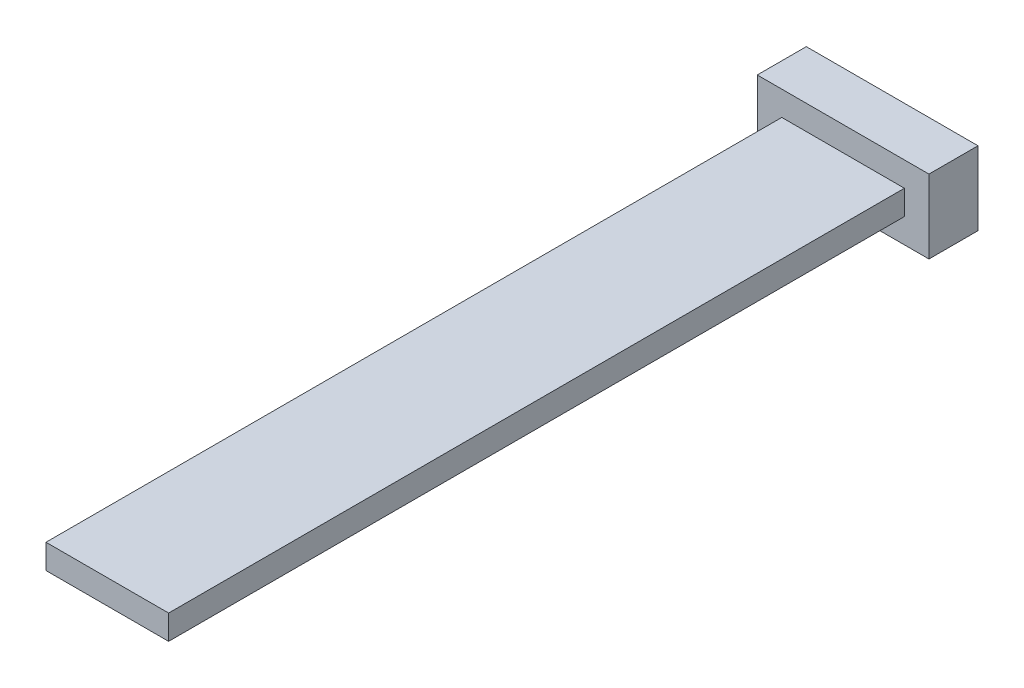
ISO-10303-21;
HEADER;
FILE_DESCRIPTION(('STEP AP214'),'2;1');
FILE_NAME('part.step','',(''),(''),'','','');
FILE_SCHEMA(('AUTOMOTIVE_DESIGN { 1 0 10303 214 1 1 1 1 }'));
ENDSEC;
DATA;
#1=APPLICATION_CONTEXT('core data for automotive mechanical design processes');
#2=APPLICATION_PROTOCOL_DEFINITION('international standard','automotive_design',2000,#1);
#3=PRODUCT_CONTEXT('',#1,'mechanical');
#4=PRODUCT('Part','Part','',(#3));
#5=PRODUCT_RELATED_PRODUCT_CATEGORY('part','',(#4));
#6=PRODUCT_DEFINITION_FORMATION('','',#4);
#7=PRODUCT_DEFINITION_CONTEXT('part definition',#1,'design');
#8=PRODUCT_DEFINITION('design','',#6,#7);
#9=PRODUCT_DEFINITION_SHAPE('','',#8);
#10=(LENGTH_UNIT() NAMED_UNIT(*) SI_UNIT(.MILLI.,.METRE.));
#11=(NAMED_UNIT(*) PLANE_ANGLE_UNIT() SI_UNIT($,.RADIAN.));
#12=(NAMED_UNIT(*) SI_UNIT($,.STERADIAN.) SOLID_ANGLE_UNIT());
#13=UNCERTAINTY_MEASURE_WITH_UNIT(LENGTH_MEASURE(1.E-05),#10,'distance_accuracy_value','');
#14=(GEOMETRIC_REPRESENTATION_CONTEXT(3) GLOBAL_UNCERTAINTY_ASSIGNED_CONTEXT((#13)) GLOBAL_UNIT_ASSIGNED_CONTEXT((#10,
#11,#12)) REPRESENTATION_CONTEXT('',''));
#15=CARTESIAN_POINT('',(0.,0.,0.));
#16=DIRECTION('',(0.,0.,1.));
#17=DIRECTION('',(1.,0.,0.));
#18=AXIS2_PLACEMENT_3D('',#15,#16,#17);
#19=CARTESIAN_POINT('',(0.,0.,300.));
#20=DIRECTION('',(1.,0.,0.));
#21=DIRECTION('',(0.,0.,-1.));
#22=AXIS2_PLACEMENT_3D('',#19,#20,#21);
#23=PLANE('',#22);
#24=DIRECTION('',(0.,-1.,0.));
#25=VECTOR('',#24,1.);
#26=CARTESIAN_POINT('',(0.,0.,0.));
#27=LINE('',#26,#25);
#28=CARTESIAN_POINT('',(0.,10.,0.));
#29=VERTEX_POINT('',#28);
#30=CARTESIAN_POINT('',(0.,0.,0.));
#31=VERTEX_POINT('',#30);
#32=EDGE_CURVE('E124',#29,#31,#27,.T.);
#33=ORIENTED_EDGE('',*,*,#32,.T.);
#34=DIRECTION('',(0.,0.,-1.));
#35=VECTOR('',#34,1.);
#36=CARTESIAN_POINT('',(0.,0.,300.));
#37=LINE('',#36,#35);
#38=CARTESIAN_POINT('',(0.,0.,300.));
#39=VERTEX_POINT('',#38);
#40=EDGE_CURVE('E11',#39,#31,#37,.T.);
#41=ORIENTED_EDGE('',*,*,#40,.F.);
#42=DIRECTION('',(0.,-1.,0.));
#43=VECTOR('',#42,1.);
#44=CARTESIAN_POINT('',(0.,0.,300.));
#45=LINE('',#44,#43);
#46=CARTESIAN_POINT('',(0.,10.,300.));
#47=VERTEX_POINT('',#46);
#48=EDGE_CURVE('E133',#47,#39,#45,.T.);
#49=ORIENTED_EDGE('',*,*,#48,.F.);
#50=DIRECTION('',(0.,0.,-1.));
#51=VECTOR('',#50,1.);
#52=CARTESIAN_POINT('',(0.,10.,300.));
#53=LINE('',#52,#51);
#54=EDGE_CURVE('E140',#47,#29,#53,.T.);
#55=ORIENTED_EDGE('',*,*,#54,.T.);
#56=EDGE_LOOP('',(#33,#41,#49,#55));
#57=FACE_BOUND('',#56,.T.);
#58=ADVANCED_FACE('F39',(#57),#23,.F.);
#59=CARTESIAN_POINT('',(0.,0.,300.));
#60=DIRECTION('',(0.,1.,0.));
#61=DIRECTION('',(0.,0.,1.));
#62=AXIS2_PLACEMENT_3D('',#59,#60,#61);
#63=PLANE('',#62);
#64=DIRECTION('',(1.,0.,0.));
#65=VECTOR('',#64,1.);
#66=CARTESIAN_POINT('',(0.,0.,0.));
#67=LINE('',#66,#65);
#68=CARTESIAN_POINT('',(50.,0.,0.));
#69=VERTEX_POINT('',#68);
#70=EDGE_CURVE('E127',#31,#69,#67,.T.);
#71=ORIENTED_EDGE('',*,*,#70,.T.);
#72=DIRECTION('',(0.,0.,-1.));
#73=VECTOR('',#72,1.);
#74=CARTESIAN_POINT('',(50.,0.,300.));
#75=LINE('',#74,#73);
#76=CARTESIAN_POINT('',(50.,0.,300.));
#77=VERTEX_POINT('',#76);
#78=EDGE_CURVE('E47',#77,#69,#75,.T.);
#79=ORIENTED_EDGE('',*,*,#78,.F.);
#80=DIRECTION('',(1.,0.,0.));
#81=VECTOR('',#80,1.);
#82=CARTESIAN_POINT('',(0.,0.,300.));
#83=LINE('',#82,#81);
#84=EDGE_CURVE('E135',#39,#77,#83,.T.);
#85=ORIENTED_EDGE('',*,*,#84,.F.);
#86=ORIENTED_EDGE('',*,*,#40,.T.);
#87=EDGE_LOOP('',(#71,#79,#85,#86));
#88=FACE_BOUND('',#87,.T.);
#89=ADVANCED_FACE('F160',(#88),#63,.F.);
#90=CARTESIAN_POINT('',(50.,0.,300.));
#91=DIRECTION('',(-1.,0.,0.));
#92=DIRECTION('',(0.,0.,1.));
#93=AXIS2_PLACEMENT_3D('',#90,#91,#92);
#94=PLANE('',#93);
#95=DIRECTION('',(0.,1.,0.));
#96=VECTOR('',#95,1.);
#97=CARTESIAN_POINT('',(50.,0.,0.));
#98=LINE('',#97,#96);
#99=CARTESIAN_POINT('',(50.,10.,0.));
#100=VERTEX_POINT('',#99);
#101=EDGE_CURVE('E144',#69,#100,#98,.T.);
#102=ORIENTED_EDGE('',*,*,#101,.T.);
#103=DIRECTION('',(0.,0.,-1.));
#104=VECTOR('',#103,1.);
#105=CARTESIAN_POINT('',(50.,10.,300.));
#106=LINE('',#105,#104);
#107=CARTESIAN_POINT('',(50.,10.,300.));
#108=VERTEX_POINT('',#107);
#109=EDGE_CURVE('E151',#108,#100,#106,.T.);
#110=ORIENTED_EDGE('',*,*,#109,.F.);
#111=DIRECTION('',(0.,1.,0.));
#112=VECTOR('',#111,1.);
#113=CARTESIAN_POINT('',(50.,0.,300.));
#114=LINE('',#113,#112);
#115=EDGE_CURVE('E138',#77,#108,#114,.T.);
#116=ORIENTED_EDGE('',*,*,#115,.F.);
#117=ORIENTED_EDGE('',*,*,#78,.T.);
#118=EDGE_LOOP('',(#102,#110,#116,#117));
#119=FACE_BOUND('',#118,.T.);
#120=ADVANCED_FACE('F157',(#119),#94,.F.);
#121=CARTESIAN_POINT('',(0.,10.,300.));
#122=DIRECTION('',(0.,-1.,0.));
#123=DIRECTION('',(0.,0.,-1.));
#124=AXIS2_PLACEMENT_3D('',#121,#122,#123);
#125=PLANE('',#124);
#126=DIRECTION('',(-1.,0.,0.));
#127=VECTOR('',#126,1.);
#128=CARTESIAN_POINT('',(0.,10.,0.));
#129=LINE('',#128,#127);
#130=EDGE_CURVE('E136',#100,#29,#129,.T.);
#131=ORIENTED_EDGE('',*,*,#130,.T.);
#132=ORIENTED_EDGE('',*,*,#54,.F.);
#133=DIRECTION('',(-1.,0.,0.));
#134=VECTOR('',#133,1.);
#135=CARTESIAN_POINT('',(0.,10.,300.));
#136=LINE('',#135,#134);
#137=EDGE_CURVE('E54',#108,#47,#136,.T.);
#138=ORIENTED_EDGE('',*,*,#137,.F.);
#139=ORIENTED_EDGE('',*,*,#109,.T.);
#140=EDGE_LOOP('',(#131,#132,#138,#139));
#141=FACE_BOUND('',#140,.T.);
#142=ADVANCED_FACE('F166',(#141),#125,.F.);
#143=CARTESIAN_POINT('',(0.,10.,300.));
#144=DIRECTION('',(0.,0.,-1.));
#145=DIRECTION('',(-1.,0.,0.));
#146=AXIS2_PLACEMENT_3D('',#143,#144,#145);
#147=PLANE('',#146);
#148=ORIENTED_EDGE('',*,*,#48,.T.);
#149=ORIENTED_EDGE('',*,*,#84,.T.);
#150=ORIENTED_EDGE('',*,*,#115,.T.);
#151=ORIENTED_EDGE('',*,*,#137,.T.);
#152=EDGE_LOOP('',(#148,#149,#150,#151));
#153=FACE_BOUND('',#152,.T.);
#154=ADVANCED_FACE('F169',(#153),#147,.F.);
#155=CARTESIAN_POINT('',(0.,0.,0.));
#156=DIRECTION('',(0.,0.,1.));
#157=DIRECTION('',(1.,0.,0.));
#158=AXIS2_PLACEMENT_3D('',#155,#156,#157);
#159=PLANE('',#158);
#160=DIRECTION('',(0.,1.,0.));
#161=VECTOR('',#160,1.);
#162=CARTESIAN_POINT('',(-10.,20.,0.));
#163=LINE('',#162,#161);
#164=CARTESIAN_POINT('',(-10.,-10.,0.));
#165=VERTEX_POINT('',#164);
#166=CARTESIAN_POINT('',(-10.,20.,0.));
#167=VERTEX_POINT('',#166);
#168=EDGE_CURVE('E123',#165,#167,#163,.T.);
#169=ORIENTED_EDGE('',*,*,#168,.F.);
#170=DIRECTION('',(-1.,0.,0.));
#171=VECTOR('',#170,1.);
#172=CARTESIAN_POINT('',(-10.,-10.,0.));
#173=LINE('',#172,#171);
#174=CARTESIAN_POINT('',(60.,-10.,0.));
#175=VERTEX_POINT('',#174);
#176=EDGE_CURVE('E119',#175,#165,#173,.T.);
#177=ORIENTED_EDGE('',*,*,#176,.F.);
#178=DIRECTION('',(0.,-1.,0.));
#179=VECTOR('',#178,1.);
#180=CARTESIAN_POINT('',(60.,20.,0.));
#181=LINE('',#180,#179);
#182=CARTESIAN_POINT('',(60.,20.,0.));
#183=VERTEX_POINT('',#182);
#184=EDGE_CURVE('E253',#183,#175,#181,.T.);
#185=ORIENTED_EDGE('',*,*,#184,.F.);
#186=DIRECTION('',(1.,0.,0.));
#187=VECTOR('',#186,1.);
#188=CARTESIAN_POINT('',(-10.,20.,0.));
#189=LINE('',#188,#187);
#190=EDGE_CURVE('E256',#167,#183,#189,.T.);
#191=ORIENTED_EDGE('',*,*,#190,.F.);
#192=EDGE_LOOP('',(#169,#177,#185,#191));
#193=FACE_BOUND('',#192,.T.);
#194=ORIENTED_EDGE('',*,*,#32,.F.);
#195=ORIENTED_EDGE('',*,*,#130,.F.);
#196=ORIENTED_EDGE('',*,*,#101,.F.);
#197=ORIENTED_EDGE('',*,*,#70,.F.);
#198=EDGE_LOOP('',(#194,#195,#196,#197));
#199=FACE_BOUND('',#198,.T.);
#200=ADVANCED_FACE('F164',(#193,#199),#159,.T.);
#201=CARTESIAN_POINT('',(-10.,20.,-20.));
#202=DIRECTION('',(1.,0.,0.));
#203=DIRECTION('',(0.,1.,0.));
#204=AXIS2_PLACEMENT_3D('',#201,#202,#203);
#205=PLANE('',#204);
#206=ORIENTED_EDGE('',*,*,#168,.T.);
#207=DIRECTION('',(0.,0.,1.));
#208=VECTOR('',#207,1.);
#209=CARTESIAN_POINT('',(-10.,20.,-20.));
#210=LINE('',#209,#208);
#211=CARTESIAN_POINT('',(-10.,20.,-20.));
#212=VERTEX_POINT('',#211);
#213=EDGE_CURVE('E103',#212,#167,#210,.T.);
#214=ORIENTED_EDGE('',*,*,#213,.F.);
#215=DIRECTION('',(0.,1.,0.));
#216=VECTOR('',#215,1.);
#217=CARTESIAN_POINT('',(-10.,20.,-20.));
#218=LINE('',#217,#216);
#219=CARTESIAN_POINT('',(-10.,-10.,-20.));
#220=VERTEX_POINT('',#219);
#221=EDGE_CURVE('E110',#220,#212,#218,.T.);
#222=ORIENTED_EDGE('',*,*,#221,.F.);
#223=DIRECTION('',(0.,0.,1.));
#224=VECTOR('',#223,1.);
#225=CARTESIAN_POINT('',(-10.,-10.,-20.));
#226=LINE('',#225,#224);
#227=EDGE_CURVE('E250',#220,#165,#226,.T.);
#228=ORIENTED_EDGE('',*,*,#227,.T.);
#229=EDGE_LOOP('',(#206,#214,#222,#228));
#230=FACE_BOUND('',#229,.T.);
#231=ADVANCED_FACE('F121',(#230),#205,.F.);
#232=CARTESIAN_POINT('',(-10.,20.,-20.));
#233=DIRECTION('',(0.,-1.,0.));
#234=DIRECTION('',(1.,0.,0.));
#235=AXIS2_PLACEMENT_3D('',#232,#233,#234);
#236=PLANE('',#235);
#237=ORIENTED_EDGE('',*,*,#190,.T.);
#238=DIRECTION('',(0.,0.,1.));
#239=VECTOR('',#238,1.);
#240=CARTESIAN_POINT('',(60.,20.,-20.));
#241=LINE('',#240,#239);
#242=CARTESIAN_POINT('',(60.,20.,-20.));
#243=VERTEX_POINT('',#242);
#244=EDGE_CURVE('E106',#243,#183,#241,.T.);
#245=ORIENTED_EDGE('',*,*,#244,.F.);
#246=DIRECTION('',(1.,0.,0.));
#247=VECTOR('',#246,1.);
#248=CARTESIAN_POINT('',(-10.,20.,-20.));
#249=LINE('',#248,#247);
#250=EDGE_CURVE('E99',#212,#243,#249,.T.);
#251=ORIENTED_EDGE('',*,*,#250,.F.);
#252=ORIENTED_EDGE('',*,*,#213,.T.);
#253=EDGE_LOOP('',(#237,#245,#251,#252));
#254=FACE_BOUND('',#253,.T.);
#255=ADVANCED_FACE('F101',(#254),#236,.F.);
#256=CARTESIAN_POINT('',(60.,20.,-20.));
#257=DIRECTION('',(-1.,0.,0.));
#258=DIRECTION('',(0.,-1.,0.));
#259=AXIS2_PLACEMENT_3D('',#256,#257,#258);
#260=PLANE('',#259);
#261=ORIENTED_EDGE('',*,*,#184,.T.);
#262=DIRECTION('',(0.,0.,1.));
#263=VECTOR('',#262,1.);
#264=CARTESIAN_POINT('',(60.,-10.,-20.));
#265=LINE('',#264,#263);
#266=CARTESIAN_POINT('',(60.,-10.,-20.));
#267=VERTEX_POINT('',#266);
#268=EDGE_CURVE('E129',#267,#175,#265,.T.);
#269=ORIENTED_EDGE('',*,*,#268,.F.);
#270=DIRECTION('',(0.,-1.,0.));
#271=VECTOR('',#270,1.);
#272=CARTESIAN_POINT('',(60.,20.,-20.));
#273=LINE('',#272,#271);
#274=EDGE_CURVE('E109',#243,#267,#273,.T.);
#275=ORIENTED_EDGE('',*,*,#274,.F.);
#276=ORIENTED_EDGE('',*,*,#244,.T.);
#277=EDGE_LOOP('',(#261,#269,#275,#276));
#278=FACE_BOUND('',#277,.T.);
#279=ADVANCED_FACE('F217',(#278),#260,.F.);
#280=CARTESIAN_POINT('',(-10.,-10.,-20.));
#281=DIRECTION('',(0.,1.,0.));
#282=DIRECTION('',(-1.,0.,0.));
#283=AXIS2_PLACEMENT_3D('',#280,#281,#282);
#284=PLANE('',#283);
#285=ORIENTED_EDGE('',*,*,#176,.T.);
#286=ORIENTED_EDGE('',*,*,#227,.F.);
#287=DIRECTION('',(-1.,0.,0.));
#288=VECTOR('',#287,1.);
#289=CARTESIAN_POINT('',(-10.,-10.,-20.));
#290=LINE('',#289,#288);
#291=EDGE_CURVE('E115',#267,#220,#290,.T.);
#292=ORIENTED_EDGE('',*,*,#291,.F.);
#293=ORIENTED_EDGE('',*,*,#268,.T.);
#294=EDGE_LOOP('',(#285,#286,#292,#293));
#295=FACE_BOUND('',#294,.T.);
#296=ADVANCED_FACE('F226',(#295),#284,.F.);
#297=CARTESIAN_POINT('',(0.,0.,-20.));
#298=DIRECTION('',(0.,0.,1.));
#299=DIRECTION('',(1.,0.,0.));
#300=AXIS2_PLACEMENT_3D('',#297,#298,#299);
#301=PLANE('',#300);
#302=ORIENTED_EDGE('',*,*,#221,.T.);
#303=ORIENTED_EDGE('',*,*,#250,.T.);
#304=ORIENTED_EDGE('',*,*,#274,.T.);
#305=ORIENTED_EDGE('',*,*,#291,.T.);
#306=EDGE_LOOP('',(#302,#303,#304,#305));
#307=FACE_BOUND('',#306,.T.);
#308=ADVANCED_FACE('F113',(#307),#301,.F.);
#309=CLOSED_SHELL('',(#58,#89,#120,#142,#154,#200,#231,#255,#279,#296,#308));
#310=MANIFOLD_SOLID_BREP('B2',#309);
#311=ADVANCED_BREP_SHAPE_REPRESENTATION('',(#18,#310),#14);
#312=SHAPE_DEFINITION_REPRESENTATION(#9,#311);
ENDSEC;
END-ISO-10303-21;
